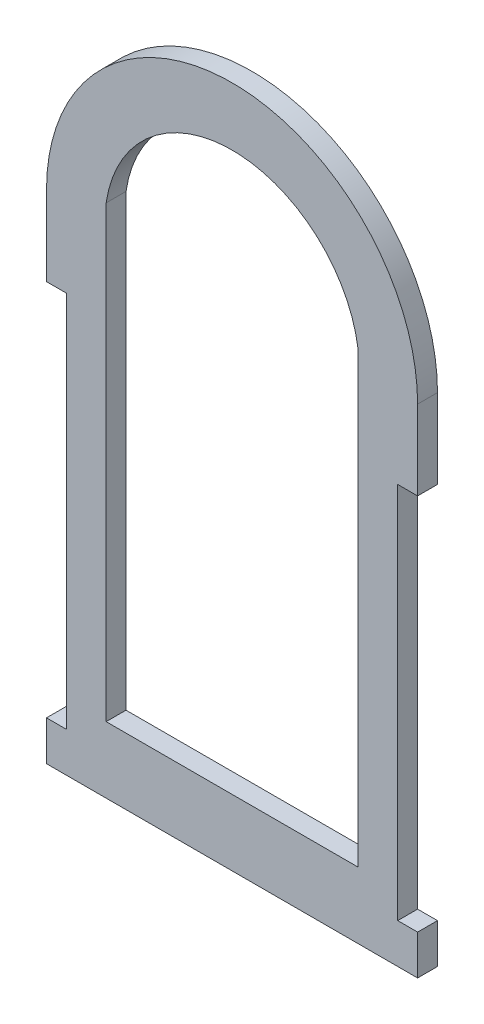
ISO-10303-21;
HEADER;
FILE_DESCRIPTION(('STEP AP214'),'2;1');
FILE_NAME('part.step','',(''),(''),'','','');
FILE_SCHEMA(('AUTOMOTIVE_DESIGN { 1 0 10303 214 1 1 1 1 }'));
ENDSEC;
DATA;
#1=APPLICATION_CONTEXT('core data for automotive mechanical design processes');
#2=APPLICATION_PROTOCOL_DEFINITION('international standard','automotive_design',2000,#1);
#3=PRODUCT_CONTEXT('',#1,'mechanical');
#4=PRODUCT('Part','Part','',(#3));
#5=PRODUCT_RELATED_PRODUCT_CATEGORY('part','',(#4));
#6=PRODUCT_DEFINITION_FORMATION('','',#4);
#7=PRODUCT_DEFINITION_CONTEXT('part definition',#1,'design');
#8=PRODUCT_DEFINITION('design','',#6,#7);
#9=PRODUCT_DEFINITION_SHAPE('','',#8);
#10=(LENGTH_UNIT() NAMED_UNIT(*) SI_UNIT(.MILLI.,.METRE.));
#11=(NAMED_UNIT(*) PLANE_ANGLE_UNIT() SI_UNIT($,.RADIAN.));
#12=(NAMED_UNIT(*) SI_UNIT($,.STERADIAN.) SOLID_ANGLE_UNIT());
#13=UNCERTAINTY_MEASURE_WITH_UNIT(LENGTH_MEASURE(1.E-05),#10,'distance_accuracy_value','');
#14=(GEOMETRIC_REPRESENTATION_CONTEXT(3) GLOBAL_UNCERTAINTY_ASSIGNED_CONTEXT((#13)) GLOBAL_UNIT_ASSIGNED_CONTEXT((#10,
#11,#12)) REPRESENTATION_CONTEXT('',''));
#15=CARTESIAN_POINT('',(0.,0.,0.));
#16=DIRECTION('',(0.,0.,1.));
#17=DIRECTION('',(1.,0.,0.));
#18=AXIS2_PLACEMENT_3D('',#15,#16,#17);
#19=CARTESIAN_POINT('',(-19.,0.,3.));
#20=DIRECTION('',(-1.,0.,0.));
#21=DIRECTION('',(0.,-1.,0.));
#22=AXIS2_PLACEMENT_3D('',#19,#20,#21);
#23=PLANE('',#22);
#24=DIRECTION('',(0.,1.,0.));
#25=VECTOR('',#24,1.);
#26=CARTESIAN_POINT('',(-19.,0.,3.));
#27=LINE('',#26,#25);
#28=CARTESIAN_POINT('',(-19.,8.99999999999999,3.));
#29=VERTEX_POINT('',#28);
#30=CARTESIAN_POINT('',(-19.,76.7954545459982,3.));
#31=VERTEX_POINT('',#30);
#32=EDGE_CURVE('E57',#29,#31,#27,.T.);
#33=ORIENTED_EDGE('',*,*,#32,.F.);
#34=DIRECTION('',(0.,0.,1.));
#35=VECTOR('',#34,1.);
#36=CARTESIAN_POINT('',(-19.,8.99999999999999,0.));
#37=LINE('',#36,#35);
#38=CARTESIAN_POINT('',(-19.,8.99999999999999,0.));
#39=VERTEX_POINT('',#38);
#40=EDGE_CURVE('E159',#39,#29,#37,.T.);
#41=ORIENTED_EDGE('',*,*,#40,.F.);
#42=DIRECTION('',(0.,1.,0.));
#43=VECTOR('',#42,1.);
#44=CARTESIAN_POINT('',(-19.,0.,0.));
#45=LINE('',#44,#43);
#46=CARTESIAN_POINT('',(-19.,76.7954545459982,0.));
#47=VERTEX_POINT('',#46);
#48=EDGE_CURVE('E154',#39,#47,#45,.T.);
#49=ORIENTED_EDGE('',*,*,#48,.T.);
#50=DIRECTION('',(0.,0.,-1.));
#51=VECTOR('',#50,1.);
#52=CARTESIAN_POINT('',(-19.,76.7954545459982,3.));
#53=LINE('',#52,#51);
#54=EDGE_CURVE('E11',#31,#47,#53,.T.);
#55=ORIENTED_EDGE('',*,*,#54,.F.);
#56=EDGE_LOOP('',(#33,#41,#49,#55));
#57=FACE_BOUND('',#56,.T.);
#58=ADVANCED_FACE('F43',(#57),#23,.F.);
#59=CARTESIAN_POINT('',(0.,74.0000000041629,3.));
#60=DIRECTION('',(0.,0.,-1.));
#61=DIRECTION('',(-1.,0.,0.));
#62=AXIS2_PLACEMENT_3D('',#59,#60,#61);
#63=CYLINDRICAL_SURFACE('',#62,19.2045454540186);
#64=CARTESIAN_POINT('',(0.,74.0000000041629,0.));
#65=DIRECTION('',(0.,0.,1.));
#66=DIRECTION('',(1.,0.,0.));
#67=AXIS2_PLACEMENT_3D('',#64,#65,#66);
#68=CIRCLE('',#67,19.2045454540186);
#69=CARTESIAN_POINT('',(19.,76.7954545459982,0.));
#70=VERTEX_POINT('',#69);
#71=EDGE_CURVE('E158',#47,#70,#68,.F.);
#72=ORIENTED_EDGE('',*,*,#71,.T.);
#73=DIRECTION('',(0.,0.,-1.));
#74=VECTOR('',#73,1.);
#75=CARTESIAN_POINT('',(19.,76.7954545459982,3.));
#76=LINE('',#75,#74);
#77=CARTESIAN_POINT('',(19.,76.7954545459982,3.));
#78=VERTEX_POINT('',#77);
#79=EDGE_CURVE('E50',#78,#70,#76,.T.);
#80=ORIENTED_EDGE('',*,*,#79,.F.);
#81=CARTESIAN_POINT('',(0.,74.0000000041629,3.));
#82=DIRECTION('',(0.,0.,1.));
#83=DIRECTION('',(1.,0.,0.));
#84=AXIS2_PLACEMENT_3D('',#81,#82,#83);
#85=CIRCLE('',#84,19.2045454540186);
#86=EDGE_CURVE('E174',#31,#78,#85,.F.);
#87=ORIENTED_EDGE('',*,*,#86,.F.);
#88=ORIENTED_EDGE('',*,*,#54,.T.);
#89=EDGE_LOOP('',(#72,#80,#87,#88));
#90=FACE_BOUND('',#89,.T.);
#91=ADVANCED_FACE('F279',(#90),#63,.F.);
#92=CARTESIAN_POINT('',(19.,0.,3.));
#93=DIRECTION('',(-1.,0.,0.));
#94=DIRECTION('',(0.,-1.,0.));
#95=AXIS2_PLACEMENT_3D('',#92,#93,#94);
#96=PLANE('',#95);
#97=DIRECTION('',(0.,0.,1.));
#98=VECTOR('',#97,1.);
#99=CARTESIAN_POINT('',(19.,8.99999999999999,0.));
#100=LINE('',#99,#98);
#101=CARTESIAN_POINT('',(19.,8.99999999999999,0.));
#102=VERTEX_POINT('',#101);
#103=CARTESIAN_POINT('',(19.,8.99999999999999,3.));
#104=VERTEX_POINT('',#103);
#105=EDGE_CURVE('E163',#102,#104,#100,.T.);
#106=ORIENTED_EDGE('',*,*,#105,.T.);
#107=DIRECTION('',(0.,1.,0.));
#108=VECTOR('',#107,1.);
#109=CARTESIAN_POINT('',(19.,0.,3.));
#110=LINE('',#109,#108);
#111=EDGE_CURVE('E178',#104,#78,#110,.T.);
#112=ORIENTED_EDGE('',*,*,#111,.T.);
#113=ORIENTED_EDGE('',*,*,#79,.T.);
#114=DIRECTION('',(0.,1.,0.));
#115=VECTOR('',#114,1.);
#116=CARTESIAN_POINT('',(19.,0.,0.));
#117=LINE('',#116,#115);
#118=EDGE_CURVE('E213',#102,#70,#117,.T.);
#119=ORIENTED_EDGE('',*,*,#118,.F.);
#120=EDGE_LOOP('',(#106,#112,#113,#119));
#121=FACE_BOUND('',#120,.T.);
#122=ADVANCED_FACE('F275',(#121),#96,.T.);
#123=CARTESIAN_POINT('',(28.,0.,3.));
#124=DIRECTION('',(1.,0.,0.));
#125=DIRECTION('',(0.,0.,-1.));
#126=AXIS2_PLACEMENT_3D('',#123,#124,#125);
#127=PLANE('',#126);
#128=DIRECTION('',(0.,-1.,0.));
#129=VECTOR('',#128,1.);
#130=CARTESIAN_POINT('',(28.,0.,0.));
#131=LINE('',#130,#129);
#132=CARTESIAN_POINT('',(28.,4.99999999999999,0.));
#133=VERTEX_POINT('',#132);
#134=CARTESIAN_POINT('',(28.,-1.00000000000001,0.));
#135=VERTEX_POINT('',#134);
#136=EDGE_CURVE('E215',#133,#135,#131,.T.);
#137=ORIENTED_EDGE('',*,*,#136,.F.);
#138=DIRECTION('',(0.,0.,-1.));
#139=VECTOR('',#138,1.);
#140=CARTESIAN_POINT('',(28.,4.99999999999999,3.));
#141=LINE('',#140,#139);
#142=CARTESIAN_POINT('',(28.,4.99999999999999,3.));
#143=VERTEX_POINT('',#142);
#144=EDGE_CURVE('E268',#143,#133,#141,.T.);
#145=ORIENTED_EDGE('',*,*,#144,.F.);
#146=DIRECTION('',(0.,-1.,0.));
#147=VECTOR('',#146,1.);
#148=CARTESIAN_POINT('',(28.,0.,3.));
#149=LINE('',#148,#147);
#150=CARTESIAN_POINT('',(28.,-1.00000000000001,3.));
#151=VERTEX_POINT('',#150);
#152=EDGE_CURVE('E182',#143,#151,#149,.T.);
#153=ORIENTED_EDGE('',*,*,#152,.T.);
#154=DIRECTION('',(0.,0.,-1.));
#155=VECTOR('',#154,1.);
#156=CARTESIAN_POINT('',(28.,-1.00000000000001,3.));
#157=LINE('',#156,#155);
#158=EDGE_CURVE('E270',#151,#135,#157,.T.);
#159=ORIENTED_EDGE('',*,*,#158,.T.);
#160=EDGE_LOOP('',(#137,#145,#153,#159));
#161=FACE_BOUND('',#160,.T.);
#162=ADVANCED_FACE('F301',(#161),#127,.T.);
#163=CARTESIAN_POINT('',(0.,4.99999999999998,3.));
#164=DIRECTION('',(0.,1.,0.));
#165=DIRECTION('',(-1.,0.,0.));
#166=AXIS2_PLACEMENT_3D('',#163,#164,#165);
#167=PLANE('',#166);
#168=DIRECTION('',(1.,0.,0.));
#169=VECTOR('',#168,1.);
#170=CARTESIAN_POINT('',(0.,4.99999999999998,0.));
#171=LINE('',#170,#169);
#172=CARTESIAN_POINT('',(25.,4.99999999999999,0.));
#173=VERTEX_POINT('',#172);
#174=EDGE_CURVE('E218',#173,#133,#171,.T.);
#175=ORIENTED_EDGE('',*,*,#174,.F.);
#176=DIRECTION('',(0.,0.,-1.));
#177=VECTOR('',#176,1.);
#178=CARTESIAN_POINT('',(25.,4.99999999999999,3.));
#179=LINE('',#178,#177);
#180=CARTESIAN_POINT('',(25.,4.99999999999999,3.));
#181=VERTEX_POINT('',#180);
#182=EDGE_CURVE('E266',#181,#173,#179,.T.);
#183=ORIENTED_EDGE('',*,*,#182,.F.);
#184=DIRECTION('',(1.,0.,0.));
#185=VECTOR('',#184,1.);
#186=CARTESIAN_POINT('',(0.,4.99999999999998,3.));
#187=LINE('',#186,#185);
#188=EDGE_CURVE('E185',#181,#143,#187,.T.);
#189=ORIENTED_EDGE('',*,*,#188,.T.);
#190=ORIENTED_EDGE('',*,*,#144,.T.);
#191=EDGE_LOOP('',(#175,#183,#189,#190));
#192=FACE_BOUND('',#191,.T.);
#193=ADVANCED_FACE('F305',(#192),#167,.T.);
#194=CARTESIAN_POINT('',(25.,0.,3.));
#195=DIRECTION('',(1.,0.,0.));
#196=DIRECTION('',(0.,1.,0.));
#197=AXIS2_PLACEMENT_3D('',#194,#195,#196);
#198=PLANE('',#197);
#199=DIRECTION('',(0.,-1.,0.));
#200=VECTOR('',#199,1.);
#201=CARTESIAN_POINT('',(25.,0.,0.));
#202=LINE('',#201,#200);
#203=CARTESIAN_POINT('',(25.,62.,0.));
#204=VERTEX_POINT('',#203);
#205=EDGE_CURVE('E221',#204,#173,#202,.T.);
#206=ORIENTED_EDGE('',*,*,#205,.F.);
#207=DIRECTION('',(0.,0.,-1.));
#208=VECTOR('',#207,1.);
#209=CARTESIAN_POINT('',(25.,62.,3.));
#210=LINE('',#209,#208);
#211=CARTESIAN_POINT('',(25.,62.,3.));
#212=VERTEX_POINT('',#211);
#213=EDGE_CURVE('E264',#212,#204,#210,.T.);
#214=ORIENTED_EDGE('',*,*,#213,.F.);
#215=DIRECTION('',(0.,-1.,0.));
#216=VECTOR('',#215,1.);
#217=CARTESIAN_POINT('',(25.,0.,3.));
#218=LINE('',#217,#216);
#219=EDGE_CURVE('E188',#212,#181,#218,.T.);
#220=ORIENTED_EDGE('',*,*,#219,.T.);
#221=ORIENTED_EDGE('',*,*,#182,.T.);
#222=EDGE_LOOP('',(#206,#214,#220,#221));
#223=FACE_BOUND('',#222,.T.);
#224=ADVANCED_FACE('F308',(#223),#198,.T.);
#225=CARTESIAN_POINT('',(0.,62.,3.));
#226=DIRECTION('',(0.,-1.,0.));
#227=DIRECTION('',(0.,0.,-1.));
#228=AXIS2_PLACEMENT_3D('',#225,#226,#227);
#229=PLANE('',#228);
#230=DIRECTION('',(-1.,0.,0.));
#231=VECTOR('',#230,1.);
#232=CARTESIAN_POINT('',(0.,62.,0.));
#233=LINE('',#232,#231);
#234=CARTESIAN_POINT('',(28.,62.,0.));
#235=VERTEX_POINT('',#234);
#236=EDGE_CURVE('E224',#235,#204,#233,.T.);
#237=ORIENTED_EDGE('',*,*,#236,.F.);
#238=DIRECTION('',(0.,0.,-1.));
#239=VECTOR('',#238,1.);
#240=CARTESIAN_POINT('',(28.,62.,3.));
#241=LINE('',#240,#239);
#242=CARTESIAN_POINT('',(28.,62.,3.));
#243=VERTEX_POINT('',#242);
#244=EDGE_CURVE('E262',#243,#235,#241,.T.);
#245=ORIENTED_EDGE('',*,*,#244,.F.);
#246=DIRECTION('',(-1.,0.,0.));
#247=VECTOR('',#246,1.);
#248=CARTESIAN_POINT('',(0.,62.,3.));
#249=LINE('',#248,#247);
#250=EDGE_CURVE('E191',#243,#212,#249,.T.);
#251=ORIENTED_EDGE('',*,*,#250,.T.);
#252=ORIENTED_EDGE('',*,*,#213,.T.);
#253=EDGE_LOOP('',(#237,#245,#251,#252));
#254=FACE_BOUND('',#253,.T.);
#255=ADVANCED_FACE('F312',(#254),#229,.T.);
#256=CARTESIAN_POINT('',(28.,0.,3.));
#257=DIRECTION('',(-1.,0.,0.));
#258=DIRECTION('',(0.,0.,1.));
#259=AXIS2_PLACEMENT_3D('',#256,#257,#258);
#260=PLANE('',#259);
#261=DIRECTION('',(0.,1.,0.));
#262=VECTOR('',#261,1.);
#263=CARTESIAN_POINT('',(28.,0.,0.));
#264=LINE('',#263,#262);
#265=CARTESIAN_POINT('',(28.,73.9999692918525,0.));
#266=VERTEX_POINT('',#265);
#267=EDGE_CURVE('E227',#235,#266,#264,.T.);
#268=ORIENTED_EDGE('',*,*,#267,.T.);
#269=DIRECTION('',(0.,0.,-1.));
#270=VECTOR('',#269,1.);
#271=CARTESIAN_POINT('',(28.,73.9999692918525,3.));
#272=LINE('',#271,#270);
#273=CARTESIAN_POINT('',(28.,73.9999692918525,3.));
#274=VERTEX_POINT('',#273);
#275=EDGE_CURVE('E260',#274,#266,#272,.T.);
#276=ORIENTED_EDGE('',*,*,#275,.F.);
#277=DIRECTION('',(0.,1.,0.));
#278=VECTOR('',#277,1.);
#279=CARTESIAN_POINT('',(28.,0.,3.));
#280=LINE('',#279,#278);
#281=EDGE_CURVE('E194',#243,#274,#280,.T.);
#282=ORIENTED_EDGE('',*,*,#281,.F.);
#283=ORIENTED_EDGE('',*,*,#244,.T.);
#284=EDGE_LOOP('',(#268,#276,#282,#283));
#285=FACE_BOUND('',#284,.T.);
#286=ADVANCED_FACE('F317',(#285),#260,.F.);
#287=CARTESIAN_POINT('',(0.,74.0000000041629,3.));
#288=DIRECTION('',(0.,0.,-1.));
#289=DIRECTION('',(-1.,0.,0.));
#290=AXIS2_PLACEMENT_3D('',#287,#288,#289);
#291=CYLINDRICAL_SURFACE('',#290,28.0000000000168);
#292=CARTESIAN_POINT('',(0.,74.0000000041629,0.));
#293=DIRECTION('',(0.,0.,1.));
#294=DIRECTION('',(1.,0.,0.));
#295=AXIS2_PLACEMENT_3D('',#292,#293,#294);
#296=CIRCLE('',#295,28.0000000000168);
#297=CARTESIAN_POINT('',(-28.,73.9999692918525,0.));
#298=VERTEX_POINT('',#297);
#299=EDGE_CURVE('E230',#298,#266,#296,.F.);
#300=ORIENTED_EDGE('',*,*,#299,.F.);
#301=DIRECTION('',(0.,0.,-1.));
#302=VECTOR('',#301,1.);
#303=CARTESIAN_POINT('',(-28.,73.9999692918525,3.));
#304=LINE('',#303,#302);
#305=CARTESIAN_POINT('',(-28.,73.9999692918525,3.));
#306=VERTEX_POINT('',#305);
#307=EDGE_CURVE('E258',#306,#298,#304,.T.);
#308=ORIENTED_EDGE('',*,*,#307,.F.);
#309=CARTESIAN_POINT('',(0.,74.0000000041629,3.));
#310=DIRECTION('',(0.,0.,1.));
#311=DIRECTION('',(1.,0.,0.));
#312=AXIS2_PLACEMENT_3D('',#309,#310,#311);
#313=CIRCLE('',#312,28.0000000000168);
#314=EDGE_CURVE('E196',#306,#274,#313,.F.);
#315=ORIENTED_EDGE('',*,*,#314,.T.);
#316=ORIENTED_EDGE('',*,*,#275,.T.);
#317=EDGE_LOOP('',(#300,#308,#315,#316));
#318=FACE_BOUND('',#317,.T.);
#319=ADVANCED_FACE('F337',(#318),#291,.T.);
#320=CARTESIAN_POINT('',(-28.,0.,3.));
#321=DIRECTION('',(-1.,0.,0.));
#322=DIRECTION('',(0.,0.,1.));
#323=AXIS2_PLACEMENT_3D('',#320,#321,#322);
#324=PLANE('',#323);
#325=DIRECTION('',(0.,1.,0.));
#326=VECTOR('',#325,1.);
#327=CARTESIAN_POINT('',(-28.,0.,0.));
#328=LINE('',#327,#326);
#329=CARTESIAN_POINT('',(-28.,62.,0.));
#330=VERTEX_POINT('',#329);
#331=EDGE_CURVE('E233',#330,#298,#328,.T.);
#332=ORIENTED_EDGE('',*,*,#331,.F.);
#333=DIRECTION('',(0.,0.,-1.));
#334=VECTOR('',#333,1.);
#335=CARTESIAN_POINT('',(-28.,62.,3.));
#336=LINE('',#335,#334);
#337=CARTESIAN_POINT('',(-28.,62.,3.));
#338=VERTEX_POINT('',#337);
#339=EDGE_CURVE('E256',#338,#330,#336,.T.);
#340=ORIENTED_EDGE('',*,*,#339,.F.);
#341=DIRECTION('',(0.,1.,0.));
#342=VECTOR('',#341,1.);
#343=CARTESIAN_POINT('',(-28.,0.,3.));
#344=LINE('',#343,#342);
#345=EDGE_CURVE('E199',#338,#306,#344,.T.);
#346=ORIENTED_EDGE('',*,*,#345,.T.);
#347=ORIENTED_EDGE('',*,*,#307,.T.);
#348=EDGE_LOOP('',(#332,#340,#346,#347));
#349=FACE_BOUND('',#348,.T.);
#350=ADVANCED_FACE('F323',(#349),#324,.T.);
#351=CARTESIAN_POINT('',(0.,62.,3.));
#352=DIRECTION('',(0.,1.,0.));
#353=DIRECTION('',(0.,0.,1.));
#354=AXIS2_PLACEMENT_3D('',#351,#352,#353);
#355=PLANE('',#354);
#356=DIRECTION('',(1.,0.,0.));
#357=VECTOR('',#356,1.);
#358=CARTESIAN_POINT('',(0.,62.,0.));
#359=LINE('',#358,#357);
#360=CARTESIAN_POINT('',(-25.,62.,0.));
#361=VERTEX_POINT('',#360);
#362=EDGE_CURVE('E236',#330,#361,#359,.T.);
#363=ORIENTED_EDGE('',*,*,#362,.T.);
#364=DIRECTION('',(0.,0.,-1.));
#365=VECTOR('',#364,1.);
#366=CARTESIAN_POINT('',(-25.,62.,3.));
#367=LINE('',#366,#365);
#368=CARTESIAN_POINT('',(-25.,62.,3.));
#369=VERTEX_POINT('',#368);
#370=EDGE_CURVE('E253',#369,#361,#367,.T.);
#371=ORIENTED_EDGE('',*,*,#370,.F.);
#372=DIRECTION('',(1.,0.,0.));
#373=VECTOR('',#372,1.);
#374=CARTESIAN_POINT('',(0.,62.,3.));
#375=LINE('',#374,#373);
#376=EDGE_CURVE('E202',#338,#369,#375,.T.);
#377=ORIENTED_EDGE('',*,*,#376,.F.);
#378=ORIENTED_EDGE('',*,*,#339,.T.);
#379=EDGE_LOOP('',(#363,#371,#377,#378));
#380=FACE_BOUND('',#379,.T.);
#381=ADVANCED_FACE('F329',(#380),#355,.F.);
#382=CARTESIAN_POINT('',(-25.,0.,3.));
#383=DIRECTION('',(1.,0.,0.));
#384=DIRECTION('',(0.,1.,0.));
#385=AXIS2_PLACEMENT_3D('',#382,#383,#384);
#386=PLANE('',#385);
#387=DIRECTION('',(0.,-1.,0.));
#388=VECTOR('',#387,1.);
#389=CARTESIAN_POINT('',(-25.,0.,0.));
#390=LINE('',#389,#388);
#391=CARTESIAN_POINT('',(-25.,4.99999999999999,0.));
#392=VERTEX_POINT('',#391);
#393=EDGE_CURVE('E238',#361,#392,#390,.T.);
#394=ORIENTED_EDGE('',*,*,#393,.T.);
#395=DIRECTION('',(0.,0.,-1.));
#396=VECTOR('',#395,1.);
#397=CARTESIAN_POINT('',(-25.,4.99999999999999,3.));
#398=LINE('',#397,#396);
#399=CARTESIAN_POINT('',(-25.,4.99999999999999,3.));
#400=VERTEX_POINT('',#399);
#401=EDGE_CURVE('E250',#400,#392,#398,.T.);
#402=ORIENTED_EDGE('',*,*,#401,.F.);
#403=DIRECTION('',(0.,-1.,0.));
#404=VECTOR('',#403,1.);
#405=CARTESIAN_POINT('',(-25.,0.,3.));
#406=LINE('',#405,#404);
#407=EDGE_CURVE('E204',#369,#400,#406,.T.);
#408=ORIENTED_EDGE('',*,*,#407,.F.);
#409=ORIENTED_EDGE('',*,*,#370,.T.);
#410=EDGE_LOOP('',(#394,#402,#408,#409));
#411=FACE_BOUND('',#410,.T.);
#412=ADVANCED_FACE('F333',(#411),#386,.F.);
#413=CARTESIAN_POINT('',(0.,4.99999999999998,3.));
#414=DIRECTION('',(0.,-1.,0.));
#415=DIRECTION('',(1.,0.,0.));
#416=AXIS2_PLACEMENT_3D('',#413,#414,#415);
#417=PLANE('',#416);
#418=DIRECTION('',(-1.,0.,0.));
#419=VECTOR('',#418,1.);
#420=CARTESIAN_POINT('',(0.,4.99999999999998,0.));
#421=LINE('',#420,#419);
#422=CARTESIAN_POINT('',(-28.,4.99999999999999,0.));
#423=VERTEX_POINT('',#422);
#424=EDGE_CURVE('E240',#392,#423,#421,.T.);
#425=ORIENTED_EDGE('',*,*,#424,.T.);
#426=DIRECTION('',(0.,0.,-1.));
#427=VECTOR('',#426,1.);
#428=CARTESIAN_POINT('',(-28.,4.99999999999999,3.));
#429=LINE('',#428,#427);
#430=CARTESIAN_POINT('',(-28.,4.99999999999999,3.));
#431=VERTEX_POINT('',#430);
#432=EDGE_CURVE('E247',#431,#423,#429,.T.);
#433=ORIENTED_EDGE('',*,*,#432,.F.);
#434=DIRECTION('',(-1.,0.,0.));
#435=VECTOR('',#434,1.);
#436=CARTESIAN_POINT('',(0.,4.99999999999998,3.));
#437=LINE('',#436,#435);
#438=EDGE_CURVE('E206',#400,#431,#437,.T.);
#439=ORIENTED_EDGE('',*,*,#438,.F.);
#440=ORIENTED_EDGE('',*,*,#401,.T.);
#441=EDGE_LOOP('',(#425,#433,#439,#440));
#442=FACE_BOUND('',#441,.T.);
#443=ADVANCED_FACE('F336',(#442),#417,.F.);
#444=CARTESIAN_POINT('',(-28.,0.,3.));
#445=DIRECTION('',(1.,0.,0.));
#446=DIRECTION('',(0.,0.,-1.));
#447=AXIS2_PLACEMENT_3D('',#444,#445,#446);
#448=PLANE('',#447);
#449=DIRECTION('',(0.,-1.,0.));
#450=VECTOR('',#449,1.);
#451=CARTESIAN_POINT('',(-28.,0.,0.));
#452=LINE('',#451,#450);
#453=CARTESIAN_POINT('',(-28.,-1.00000000000001,0.));
#454=VERTEX_POINT('',#453);
#455=EDGE_CURVE('E242',#423,#454,#452,.T.);
#456=ORIENTED_EDGE('',*,*,#455,.T.);
#457=DIRECTION('',(0.,0.,-1.));
#458=VECTOR('',#457,1.);
#459=CARTESIAN_POINT('',(-28.,-1.00000000000001,3.));
#460=LINE('',#459,#458);
#461=CARTESIAN_POINT('',(-28.,-1.00000000000001,3.));
#462=VERTEX_POINT('',#461);
#463=EDGE_CURVE('E210',#462,#454,#460,.T.);
#464=ORIENTED_EDGE('',*,*,#463,.F.);
#465=DIRECTION('',(0.,-1.,0.));
#466=VECTOR('',#465,1.);
#467=CARTESIAN_POINT('',(-28.,0.,3.));
#468=LINE('',#467,#466);
#469=EDGE_CURVE('E208',#431,#462,#468,.T.);
#470=ORIENTED_EDGE('',*,*,#469,.F.);
#471=ORIENTED_EDGE('',*,*,#432,.T.);
#472=EDGE_LOOP('',(#456,#464,#470,#471));
#473=FACE_BOUND('',#472,.T.);
#474=ADVANCED_FACE('F293',(#473),#448,.F.);
#475=CARTESIAN_POINT('',(0.,-1.00000000000001,3.));
#476=DIRECTION('',(0.,1.,0.));
#477=DIRECTION('',(-1.,0.,0.));
#478=AXIS2_PLACEMENT_3D('',#475,#476,#477);
#479=PLANE('',#478);
#480=DIRECTION('',(1.,0.,0.));
#481=VECTOR('',#480,1.);
#482=CARTESIAN_POINT('',(0.,-1.00000000000001,0.));
#483=LINE('',#482,#481);
#484=EDGE_CURVE('E175',#454,#135,#483,.T.);
#485=ORIENTED_EDGE('',*,*,#484,.T.);
#486=ORIENTED_EDGE('',*,*,#158,.F.);
#487=DIRECTION('',(-1.,0.,0.));
#488=VECTOR('',#487,1.);
#489=CARTESIAN_POINT('',(0.,-1.00000000000001,3.));
#490=LINE('',#489,#488);
#491=EDGE_CURVE('E180',#151,#462,#490,.T.);
#492=ORIENTED_EDGE('',*,*,#491,.T.);
#493=ORIENTED_EDGE('',*,*,#463,.T.);
#494=EDGE_LOOP('',(#485,#486,#492,#493));
#495=FACE_BOUND('',#494,.T.);
#496=ADVANCED_FACE('F284',(#495),#479,.F.);
#497=CARTESIAN_POINT('',(0.,0.,3.));
#498=DIRECTION('',(0.,0.,1.));
#499=DIRECTION('',(1.,0.,0.));
#500=AXIS2_PLACEMENT_3D('',#497,#498,#499);
#501=PLANE('',#500);
#502=DIRECTION('',(-1.,0.,0.));
#503=VECTOR('',#502,1.);
#504=CARTESIAN_POINT('',(-19.,8.99999999999999,3.));
#505=LINE('',#504,#503);
#506=EDGE_CURVE('E168',#104,#29,#505,.T.);
#507=ORIENTED_EDGE('',*,*,#506,.T.);
#508=ORIENTED_EDGE('',*,*,#32,.T.);
#509=ORIENTED_EDGE('',*,*,#86,.T.);
#510=ORIENTED_EDGE('',*,*,#111,.F.);
#511=EDGE_LOOP('',(#507,#508,#509,#510));
#512=FACE_BOUND('',#511,.T.);
#513=ORIENTED_EDGE('',*,*,#469,.T.);
#514=ORIENTED_EDGE('',*,*,#491,.F.);
#515=ORIENTED_EDGE('',*,*,#152,.F.);
#516=ORIENTED_EDGE('',*,*,#188,.F.);
#517=ORIENTED_EDGE('',*,*,#219,.F.);
#518=ORIENTED_EDGE('',*,*,#250,.F.);
#519=ORIENTED_EDGE('',*,*,#281,.T.);
#520=ORIENTED_EDGE('',*,*,#314,.F.);
#521=ORIENTED_EDGE('',*,*,#345,.F.);
#522=ORIENTED_EDGE('',*,*,#376,.T.);
#523=ORIENTED_EDGE('',*,*,#407,.T.);
#524=ORIENTED_EDGE('',*,*,#438,.T.);
#525=EDGE_LOOP('',(#513,#514,#515,#516,#517,#518,#519,#520,#521,#522,#523,#524));
#526=FACE_BOUND('',#525,.T.);
#527=ADVANCED_FACE('F281',(#512,#526),#501,.T.);
#528=CARTESIAN_POINT('',(0.,0.,0.));
#529=DIRECTION('',(0.,0.,1.));
#530=DIRECTION('',(1.,0.,0.));
#531=AXIS2_PLACEMENT_3D('',#528,#529,#530);
#532=PLANE('',#531);
#533=ORIENTED_EDGE('',*,*,#48,.F.);
#534=DIRECTION('',(-1.,0.,0.));
#535=VECTOR('',#534,1.);
#536=CARTESIAN_POINT('',(-19.,8.99999999999999,0.));
#537=LINE('',#536,#535);
#538=EDGE_CURVE('E65',#102,#39,#537,.T.);
#539=ORIENTED_EDGE('',*,*,#538,.F.);
#540=ORIENTED_EDGE('',*,*,#118,.T.);
#541=ORIENTED_EDGE('',*,*,#71,.F.);
#542=EDGE_LOOP('',(#533,#539,#540,#541));
#543=FACE_BOUND('',#542,.T.);
#544=ORIENTED_EDGE('',*,*,#136,.T.);
#545=ORIENTED_EDGE('',*,*,#484,.F.);
#546=ORIENTED_EDGE('',*,*,#455,.F.);
#547=ORIENTED_EDGE('',*,*,#424,.F.);
#548=ORIENTED_EDGE('',*,*,#393,.F.);
#549=ORIENTED_EDGE('',*,*,#362,.F.);
#550=ORIENTED_EDGE('',*,*,#331,.T.);
#551=ORIENTED_EDGE('',*,*,#299,.T.);
#552=ORIENTED_EDGE('',*,*,#267,.F.);
#553=ORIENTED_EDGE('',*,*,#236,.T.);
#554=ORIENTED_EDGE('',*,*,#205,.T.);
#555=ORIENTED_EDGE('',*,*,#174,.T.);
#556=EDGE_LOOP('',(#544,#545,#546,#547,#548,#549,#550,#551,#552,#553,#554,#555));
#557=FACE_BOUND('',#556,.T.);
#558=ADVANCED_FACE('F155',(#543,#557),#532,.F.);
#559=CARTESIAN_POINT('',(-19.,8.99999999999999,0.));
#560=DIRECTION('',(0.,1.,0.));
#561=DIRECTION('',(0.,0.,1.));
#562=AXIS2_PLACEMENT_3D('',#559,#560,#561);
#563=PLANE('',#562);
#564=ORIENTED_EDGE('',*,*,#506,.F.);
#565=ORIENTED_EDGE('',*,*,#105,.F.);
#566=ORIENTED_EDGE('',*,*,#538,.T.);
#567=ORIENTED_EDGE('',*,*,#40,.T.);
#568=EDGE_LOOP('',(#564,#565,#566,#567));
#569=FACE_BOUND('',#568,.T.);
#570=ADVANCED_FACE('F165',(#569),#563,.T.);
#571=CLOSED_SHELL('',(#58,#91,#122,#162,#193,#224,#255,#286,#319,#350,#381,#412,#443,#474,#496,
#527,#558,#570));
#572=MANIFOLD_SOLID_BREP('B2',#571);
#573=ADVANCED_BREP_SHAPE_REPRESENTATION('',(#18,#572),#14);
#574=SHAPE_DEFINITION_REPRESENTATION(#9,#573);
ENDSEC;
END-ISO-10303-21;
